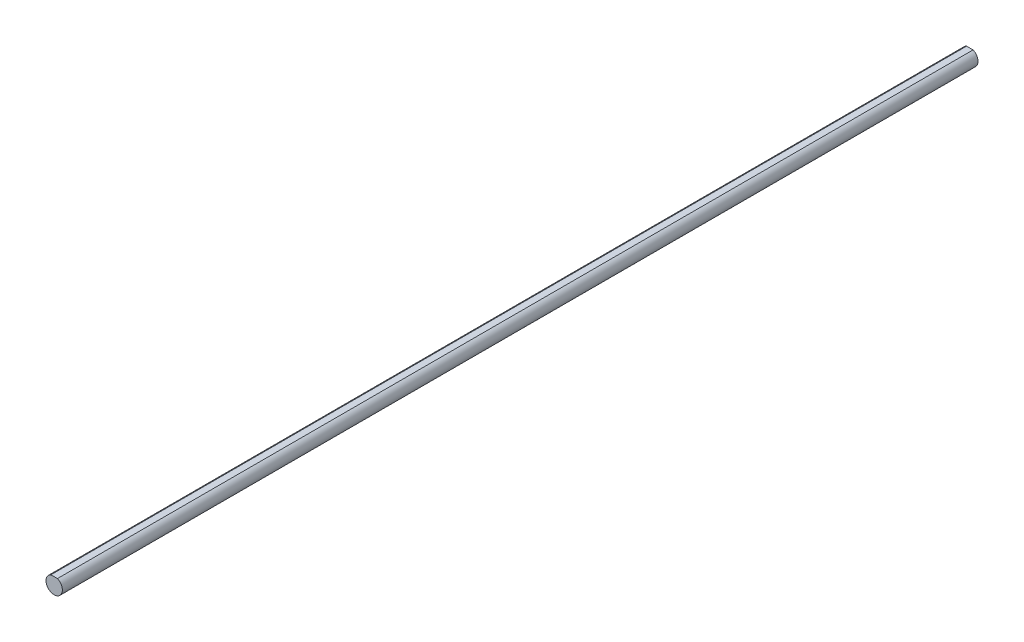
ISO-10303-21;
HEADER;
FILE_DESCRIPTION(('STEP AP214'),'2;1');
FILE_NAME('part.step','',(''),(''),'','','');
FILE_SCHEMA(('AUTOMOTIVE_DESIGN { 1 0 10303 214 1 1 1 1 }'));
ENDSEC;
DATA;
#1=APPLICATION_CONTEXT('core data for automotive mechanical design processes');
#2=APPLICATION_PROTOCOL_DEFINITION('international standard','automotive_design',2000,#1);
#3=PRODUCT_CONTEXT('',#1,'mechanical');
#4=PRODUCT('Part','Part','',(#3));
#5=PRODUCT_RELATED_PRODUCT_CATEGORY('part','',(#4));
#6=PRODUCT_DEFINITION_FORMATION('','',#4);
#7=PRODUCT_DEFINITION_CONTEXT('part definition',#1,'design');
#8=PRODUCT_DEFINITION('design','',#6,#7);
#9=PRODUCT_DEFINITION_SHAPE('','',#8);
#10=(LENGTH_UNIT() NAMED_UNIT(*) SI_UNIT(.MILLI.,.METRE.));
#11=(NAMED_UNIT(*) PLANE_ANGLE_UNIT() SI_UNIT($,.RADIAN.));
#12=(NAMED_UNIT(*) SI_UNIT($,.STERADIAN.) SOLID_ANGLE_UNIT());
#13=UNCERTAINTY_MEASURE_WITH_UNIT(LENGTH_MEASURE(1.E-05),#10,'distance_accuracy_value','');
#14=(GEOMETRIC_REPRESENTATION_CONTEXT(3) GLOBAL_UNCERTAINTY_ASSIGNED_CONTEXT((#13)) GLOBAL_UNIT_ASSIGNED_CONTEXT((#10,
#11,#12)) REPRESENTATION_CONTEXT('',''));
#15=CARTESIAN_POINT('',(0.,0.,0.));
#16=DIRECTION('',(0.,0.,1.));
#17=DIRECTION('',(1.,0.,0.));
#18=AXIS2_PLACEMENT_3D('',#15,#16,#17);
#19=CARTESIAN_POINT('',(0.,2.29128784747792,280.));
#20=DIRECTION('',(0.,1.,0.));
#21=DIRECTION('',(0.,0.,1.));
#22=AXIS2_PLACEMENT_3D('',#19,#20,#21);
#23=PLANE('',#22);
#24=DIRECTION('',(1.,0.,0.));
#25=VECTOR('',#24,1.);
#26=CARTESIAN_POINT('',(0.,2.29128784747792,0.));
#27=LINE('',#26,#25);
#28=CARTESIAN_POINT('',(-1.,2.29128784747792,0.));
#29=VERTEX_POINT('',#28);
#30=CARTESIAN_POINT('',(1.,2.29128784747792,0.));
#31=VERTEX_POINT('',#30);
#32=EDGE_CURVE('E72',#29,#31,#27,.T.);
#33=ORIENTED_EDGE('',*,*,#32,.F.);
#34=DIRECTION('',(0.,0.,-1.));
#35=VECTOR('',#34,1.);
#36=CARTESIAN_POINT('',(-1.,2.29128784747792,280.));
#37=LINE('',#36,#35);
#38=CARTESIAN_POINT('',(-1.,2.29128784747792,280.));
#39=VERTEX_POINT('',#38);
#40=EDGE_CURVE('E11',#39,#29,#37,.T.);
#41=ORIENTED_EDGE('',*,*,#40,.F.);
#42=DIRECTION('',(1.,0.,0.));
#43=VECTOR('',#42,1.);
#44=CARTESIAN_POINT('',(0.,2.29128784747792,280.));
#45=LINE('',#44,#43);
#46=CARTESIAN_POINT('',(1.,2.29128784747792,280.));
#47=VERTEX_POINT('',#46);
#48=EDGE_CURVE('E73',#39,#47,#45,.T.);
#49=ORIENTED_EDGE('',*,*,#48,.T.);
#50=DIRECTION('',(0.,0.,-1.));
#51=VECTOR('',#50,1.);
#52=CARTESIAN_POINT('',(1.,2.29128784747792,280.));
#53=LINE('',#52,#51);
#54=EDGE_CURVE('E52',#47,#31,#53,.T.);
#55=ORIENTED_EDGE('',*,*,#54,.T.);
#56=EDGE_LOOP('',(#33,#41,#49,#55));
#57=FACE_BOUND('',#56,.T.);
#58=ADVANCED_FACE('F43',(#57),#23,.T.);
#59=CARTESIAN_POINT('',(0.,0.,280.));
#60=DIRECTION('',(0.,0.,-1.));
#61=DIRECTION('',(-1.,0.,0.));
#62=AXIS2_PLACEMENT_3D('',#59,#60,#61);
#63=CYLINDRICAL_SURFACE('',#62,2.5);
#64=CARTESIAN_POINT('',(0.,0.,0.));
#65=DIRECTION('',(0.,0.,1.));
#66=DIRECTION('',(1.,0.,0.));
#67=AXIS2_PLACEMENT_3D('',#64,#65,#66);
#68=CIRCLE('',#67,2.5);
#69=EDGE_CURVE('E75',#29,#31,#68,.T.);
#70=ORIENTED_EDGE('',*,*,#69,.T.);
#71=ORIENTED_EDGE('',*,*,#54,.F.);
#72=CARTESIAN_POINT('',(0.,0.,280.));
#73=DIRECTION('',(0.,0.,1.));
#74=DIRECTION('',(1.,0.,0.));
#75=AXIS2_PLACEMENT_3D('',#72,#73,#74);
#76=CIRCLE('',#75,2.5);
#77=EDGE_CURVE('E59',#39,#47,#76,.T.);
#78=ORIENTED_EDGE('',*,*,#77,.F.);
#79=ORIENTED_EDGE('',*,*,#40,.T.);
#80=EDGE_LOOP('',(#70,#71,#78,#79));
#81=FACE_BOUND('',#80,.T.);
#82=ADVANCED_FACE('F76',(#81),#63,.T.);
#83=CARTESIAN_POINT('',(0.,0.,280.));
#84=DIRECTION('',(0.,0.,1.));
#85=DIRECTION('',(1.,0.,0.));
#86=AXIS2_PLACEMENT_3D('',#83,#84,#85);
#87=PLANE('',#86);
#88=ORIENTED_EDGE('',*,*,#48,.F.);
#89=ORIENTED_EDGE('',*,*,#77,.T.);
#90=EDGE_LOOP('',(#88,#89));
#91=FACE_BOUND('',#90,.T.);
#92=ADVANCED_FACE('F88',(#91),#87,.T.);
#93=CARTESIAN_POINT('',(0.,0.,0.));
#94=DIRECTION('',(0.,0.,1.));
#95=DIRECTION('',(1.,0.,0.));
#96=AXIS2_PLACEMENT_3D('',#93,#94,#95);
#97=PLANE('',#96);
#98=ORIENTED_EDGE('',*,*,#32,.T.);
#99=ORIENTED_EDGE('',*,*,#69,.F.);
#100=EDGE_LOOP('',(#98,#99));
#101=FACE_BOUND('',#100,.T.);
#102=ADVANCED_FACE('F80',(#101),#97,.F.);
#103=CLOSED_SHELL('',(#58,#82,#92,#102));
#104=MANIFOLD_SOLID_BREP('B2',#103);
#105=ADVANCED_BREP_SHAPE_REPRESENTATION('',(#18,#104),#14);
#106=SHAPE_DEFINITION_REPRESENTATION(#9,#105);
ENDSEC;
END-ISO-10303-21;
